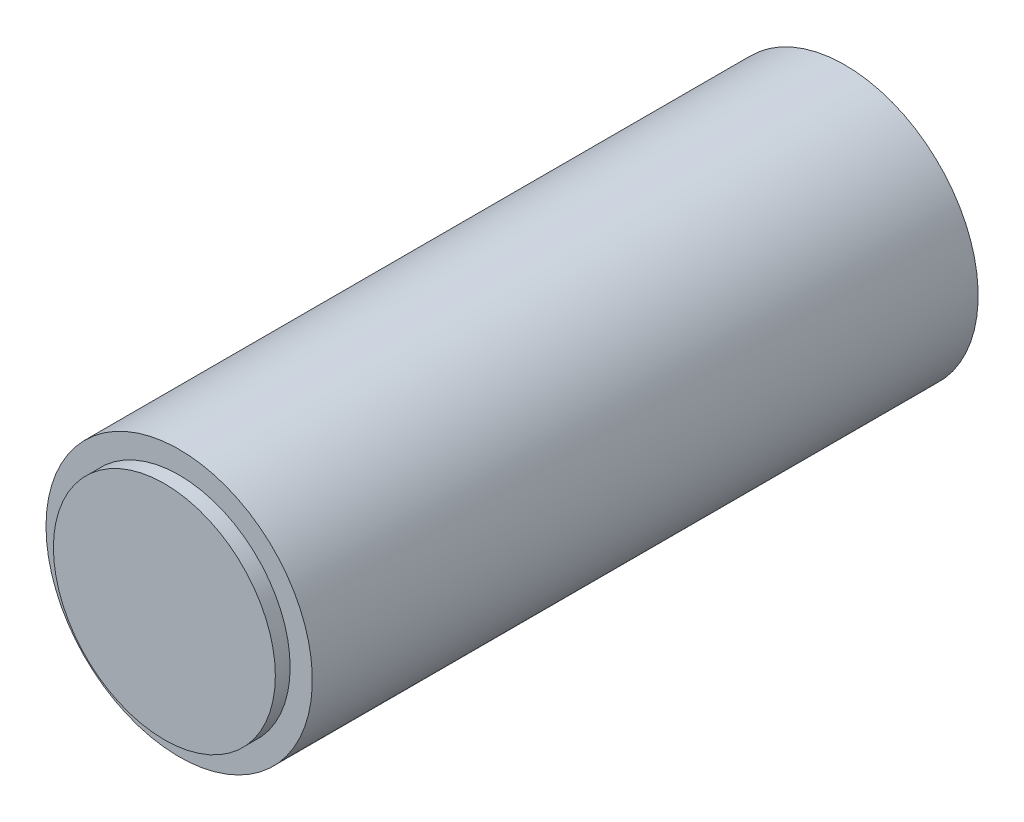
ISO-10303-21;
HEADER;
FILE_DESCRIPTION(('STEP AP214'),'2;1');
FILE_NAME('part.step','',(''),(''),'','','');
FILE_SCHEMA(('AUTOMOTIVE_DESIGN { 1 0 10303 214 1 1 1 1 }'));
ENDSEC;
DATA;
#1=APPLICATION_CONTEXT('core data for automotive mechanical design processes');
#2=APPLICATION_PROTOCOL_DEFINITION('international standard','automotive_design',2000,#1);
#3=PRODUCT_CONTEXT('',#1,'mechanical');
#4=PRODUCT('Part','Part','',(#3));
#5=PRODUCT_RELATED_PRODUCT_CATEGORY('part','',(#4));
#6=PRODUCT_DEFINITION_FORMATION('','',#4);
#7=PRODUCT_DEFINITION_CONTEXT('part definition',#1,'design');
#8=PRODUCT_DEFINITION('design','',#6,#7);
#9=PRODUCT_DEFINITION_SHAPE('','',#8);
#10=(LENGTH_UNIT() NAMED_UNIT(*) SI_UNIT(.MILLI.,.METRE.));
#11=(NAMED_UNIT(*) PLANE_ANGLE_UNIT() SI_UNIT($,.RADIAN.));
#12=(NAMED_UNIT(*) SI_UNIT($,.STERADIAN.) SOLID_ANGLE_UNIT());
#13=UNCERTAINTY_MEASURE_WITH_UNIT(LENGTH_MEASURE(1.E-05),#10,'distance_accuracy_value','');
#14=(GEOMETRIC_REPRESENTATION_CONTEXT(3) GLOBAL_UNCERTAINTY_ASSIGNED_CONTEXT((#13)) GLOBAL_UNIT_ASSIGNED_CONTEXT((#10,
#11,#12)) REPRESENTATION_CONTEXT('',''));
#15=CARTESIAN_POINT('',(0.,0.,0.));
#16=DIRECTION('',(0.,0.,1.));
#17=DIRECTION('',(1.,0.,0.));
#18=AXIS2_PLACEMENT_3D('',#15,#16,#17);
#19=CARTESIAN_POINT('',(0.,0.,45.));
#20=DIRECTION('',(0.,0.,1.));
#21=DIRECTION('',(1.,0.,0.));
#22=AXIS2_PLACEMENT_3D('',#19,#20,#21);
#23=PLANE('',#22);
#24=CARTESIAN_POINT('',(0.,0.,45.));
#25=DIRECTION('',(0.,0.,1.));
#26=DIRECTION('',(1.,0.,0.));
#27=AXIS2_PLACEMENT_3D('',#24,#25,#26);
#28=CIRCLE('',#27,9.);
#29=CARTESIAN_POINT('',(-9.,0.,45.));
#30=VERTEX_POINT('',#29);
#31=EDGE_CURVE('E10',#30,#30,#28,.T.);
#32=ORIENTED_EDGE('',*,*,#31,.T.);
#33=EDGE_LOOP('',(#32));
#34=FACE_BOUND('',#33,.T.);
#35=CARTESIAN_POINT('',(0.,0.,45.));
#36=DIRECTION('',(0.,0.,1.));
#37=DIRECTION('',(1.,0.,0.));
#38=AXIS2_PLACEMENT_3D('',#35,#36,#37);
#39=CIRCLE('',#38,7.5);
#40=CARTESIAN_POINT('',(7.5,0.,45.));
#41=VERTEX_POINT('',#40);
#42=EDGE_CURVE('E44',#41,#41,#39,.T.);
#43=ORIENTED_EDGE('',*,*,#42,.F.);
#44=EDGE_LOOP('',(#43));
#45=FACE_BOUND('',#44,.T.);
#46=ADVANCED_FACE('F31',(#34,#45),#23,.T.);
#47=CARTESIAN_POINT('',(0.,0.,45.));
#48=DIRECTION('',(0.,0.,-1.));
#49=DIRECTION('',(-1.,0.,0.));
#50=AXIS2_PLACEMENT_3D('',#47,#48,#49);
#51=CYLINDRICAL_SURFACE('',#50,9.);
#52=CARTESIAN_POINT('',(0.,0.,0.));
#53=DIRECTION('',(0.,0.,1.));
#54=DIRECTION('',(1.,0.,0.));
#55=AXIS2_PLACEMENT_3D('',#52,#53,#54);
#56=CIRCLE('',#55,9.);
#57=CARTESIAN_POINT('',(-9.,0.,0.));
#58=VERTEX_POINT('',#57);
#59=EDGE_CURVE('E35',#58,#58,#56,.T.);
#60=CARTESIAN_POINT('',(-9.,0.,45.));
#61=CARTESIAN_POINT('',(-9.,0.,44.53125));
#62=CARTESIAN_POINT('',(-9.,0.,44.0625));
#63=CARTESIAN_POINT('',(-9.,0.,43.125));
#64=CARTESIAN_POINT('',(-9.,0.,42.65625));
#65=CARTESIAN_POINT('',(-9.,0.,41.71875));
#66=CARTESIAN_POINT('',(-9.,0.,41.25));
#67=CARTESIAN_POINT('',(-9.,0.,40.3125));
#68=CARTESIAN_POINT('',(-9.,0.,39.84375));
#69=CARTESIAN_POINT('',(-9.,0.,38.90625));
#70=CARTESIAN_POINT('',(-9.,0.,38.4375));
#71=CARTESIAN_POINT('',(-9.,0.,37.5));
#72=CARTESIAN_POINT('',(-9.,0.,37.03125));
#73=CARTESIAN_POINT('',(-9.,0.,36.09375));
#74=CARTESIAN_POINT('',(-9.,0.,35.625));
#75=CARTESIAN_POINT('',(-9.,0.,34.6875));
#76=CARTESIAN_POINT('',(-9.,0.,34.21875));
#77=CARTESIAN_POINT('',(-9.,0.,33.28125));
#78=CARTESIAN_POINT('',(-9.,0.,32.8125));
#79=CARTESIAN_POINT('',(-9.,0.,31.875));
#80=CARTESIAN_POINT('',(-9.,0.,31.40625));
#81=CARTESIAN_POINT('',(-9.,0.,30.46875));
#82=CARTESIAN_POINT('',(-9.,0.,30.));
#83=CARTESIAN_POINT('',(-9.,0.,29.0625));
#84=CARTESIAN_POINT('',(-9.,0.,28.59375));
#85=CARTESIAN_POINT('',(-9.,0.,27.65625));
#86=CARTESIAN_POINT('',(-9.,0.,27.1875));
#87=CARTESIAN_POINT('',(-9.,0.,26.25));
#88=CARTESIAN_POINT('',(-9.,0.,25.78125));
#89=CARTESIAN_POINT('',(-9.,0.,24.84375));
#90=CARTESIAN_POINT('',(-9.,0.,24.375));
#91=CARTESIAN_POINT('',(-9.,0.,23.4375));
#92=CARTESIAN_POINT('',(-9.,0.,22.96875));
#93=CARTESIAN_POINT('',(-9.,0.,22.03125));
#94=CARTESIAN_POINT('',(-9.,0.,21.5625));
#95=CARTESIAN_POINT('',(-9.,0.,20.625));
#96=CARTESIAN_POINT('',(-9.,0.,20.15625));
#97=CARTESIAN_POINT('',(-9.,0.,19.21875));
#98=CARTESIAN_POINT('',(-9.,0.,18.75));
#99=CARTESIAN_POINT('',(-9.,0.,17.8125));
#100=CARTESIAN_POINT('',(-9.,0.,17.34375));
#101=CARTESIAN_POINT('',(-9.,0.,16.40625));
#102=CARTESIAN_POINT('',(-9.,0.,15.9375));
#103=CARTESIAN_POINT('',(-9.,0.,15.));
#104=CARTESIAN_POINT('',(-9.,0.,14.53125));
#105=CARTESIAN_POINT('',(-9.,0.,13.59375));
#106=CARTESIAN_POINT('',(-9.,0.,13.125));
#107=CARTESIAN_POINT('',(-9.,0.,12.1875));
#108=CARTESIAN_POINT('',(-9.,0.,11.71875));
#109=CARTESIAN_POINT('',(-9.,0.,10.78125));
#110=CARTESIAN_POINT('',(-9.,0.,10.3125));
#111=CARTESIAN_POINT('',(-9.,0.,9.375));
#112=CARTESIAN_POINT('',(-9.,0.,8.90625));
#113=CARTESIAN_POINT('',(-9.,0.,7.96874999999999));
#114=CARTESIAN_POINT('',(-9.,0.,7.5));
#115=CARTESIAN_POINT('',(-9.,0.,6.5625));
#116=CARTESIAN_POINT('',(-9.,0.,6.09375));
#117=CARTESIAN_POINT('',(-9.,0.,5.15625));
#118=CARTESIAN_POINT('',(-9.,0.,4.68749999999999));
#119=CARTESIAN_POINT('',(-9.,0.,3.74999999999999));
#120=CARTESIAN_POINT('',(-9.,0.,3.28124999999999));
#121=CARTESIAN_POINT('',(-9.,0.,2.34374999999999));
#122=CARTESIAN_POINT('',(-9.,0.,1.87499999999999));
#123=CARTESIAN_POINT('',(-9.,0.,0.937499999999992));
#124=CARTESIAN_POINT('',(-9.,0.,0.468749999999993));
#125=CARTESIAN_POINT('',(-9.,0.,0.));
#126=B_SPLINE_CURVE_WITH_KNOTS('',3,(#60,#61,#62,#63,#64,#65,#66,#67,#68,#69,#70,#71,#72,#73,
#74,#75,#76,#77,#78,#79,#80,#81,#82,#83,#84,#85,#86,#87,#88,#89,#90,#91,#92,#93,#94,#95,#96,#97,
#98,#99,#100,#101,#102,#103,#104,#105,#106,#107,#108,#109,#110,#111,#112,#113,#114,#115,#116,
#117,#118,#119,#120,#121,#122,#123,#124,#125),.UNSPECIFIED.,.F.,.F.,(4,2,2,2,2,2,2,2,2,2,2,2,2,
2,2,2,2,2,2,2,2,2,2,2,2,2,2,2,2,2,2,2,4),(0.,1.40625,2.8125,4.21875000000001,5.62500000000001,
7.03125,8.4375,9.84375000000001,11.25,12.65625,14.0625,15.46875,16.875,18.28125,19.6875,
21.09375,22.5,23.90625,25.3125,26.71875,28.125,29.53125,30.9375,32.34375,33.75,35.15625,36.5625,
37.96875,39.375,40.78125,42.1875,43.59375,45.),.UNSPECIFIED.);
#127=EDGE_CURVE('BSEAM33',#30,#58,#126,.T.);
#128=ORIENTED_EDGE('',*,*,#31,.F.);
#129=ORIENTED_EDGE('',*,*,#59,.T.);
#130=ORIENTED_EDGE('',*,*,#127,.T.);
#131=ORIENTED_EDGE('',*,*,#127,.F.);
#132=EDGE_LOOP('',(#128,#130,#129,#131));
#133=FACE_BOUND('',#132,.T.);
#134=ADVANCED_FACE('F33',(#133),#51,.T.);
#135=CARTESIAN_POINT('',(0.,0.,0.));
#136=DIRECTION('',(0.,0.,1.));
#137=DIRECTION('',(1.,0.,0.));
#138=AXIS2_PLACEMENT_3D('',#135,#136,#137);
#139=PLANE('',#138);
#140=ORIENTED_EDGE('',*,*,#59,.F.);
#141=EDGE_LOOP('',(#140));
#142=FACE_BOUND('',#141,.T.);
#143=ADVANCED_FACE('F55',(#142),#139,.F.);
#144=CARTESIAN_POINT('',(0.,0.,46.));
#145=DIRECTION('',(0.,0.,-1.));
#146=DIRECTION('',(-1.,0.,0.));
#147=AXIS2_PLACEMENT_3D('',#144,#145,#146);
#148=CYLINDRICAL_SURFACE('',#147,7.5);
#149=CARTESIAN_POINT('',(0.,0.,46.));
#150=DIRECTION('',(0.,0.,1.));
#151=DIRECTION('',(1.,0.,0.));
#152=AXIS2_PLACEMENT_3D('',#149,#150,#151);
#153=CIRCLE('',#152,7.5);
#154=CARTESIAN_POINT('',(7.5,0.,46.));
#155=VERTEX_POINT('',#154);
#156=EDGE_CURVE('E42',#155,#155,#153,.T.);
#157=ORIENTED_EDGE('',*,*,#156,.F.);
#158=EDGE_LOOP('',(#157));
#159=FACE_BOUND('',#158,.T.);
#160=ORIENTED_EDGE('',*,*,#42,.T.);
#161=EDGE_LOOP('',(#160));
#162=FACE_BOUND('',#161,.T.);
#163=ADVANCED_FACE('F52',(#159,#162),#148,.T.);
#164=CARTESIAN_POINT('',(0.,0.,46.));
#165=DIRECTION('',(0.,0.,1.));
#166=DIRECTION('',(1.,0.,0.));
#167=AXIS2_PLACEMENT_3D('',#164,#165,#166);
#168=PLANE('',#167);
#169=ORIENTED_EDGE('',*,*,#156,.T.);
#170=EDGE_LOOP('',(#169));
#171=FACE_BOUND('',#170,.T.);
#172=ADVANCED_FACE('F50',(#171),#168,.T.);
#173=CLOSED_SHELL('',(#46,#134,#143,#163,#172));
#174=MANIFOLD_SOLID_BREP('B2',#173);
#175=ADVANCED_BREP_SHAPE_REPRESENTATION('',(#18,#174),#14);
#176=SHAPE_DEFINITION_REPRESENTATION(#9,#175);
ENDSEC;
END-ISO-10303-21;
